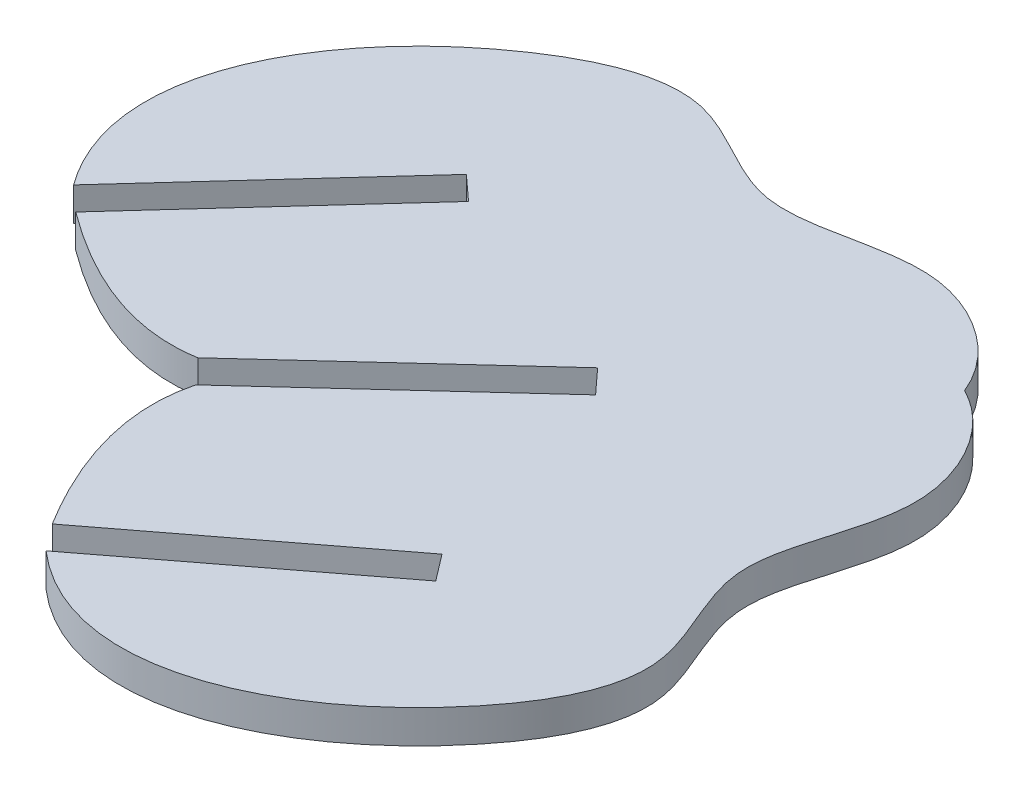
ISO-10303-21;
HEADER;
FILE_DESCRIPTION(('STEP AP214'),'2;1');
FILE_NAME('part.step','',(''),(''),'','','');
FILE_SCHEMA(('AUTOMOTIVE_DESIGN { 1 0 10303 214 1 1 1 1 }'));
ENDSEC;
DATA;
#1=APPLICATION_CONTEXT('core data for automotive mechanical design processes');
#2=APPLICATION_PROTOCOL_DEFINITION('international standard','automotive_design',2000,#1);
#3=PRODUCT_CONTEXT('',#1,'mechanical');
#4=PRODUCT('Part','Part','',(#3));
#5=PRODUCT_RELATED_PRODUCT_CATEGORY('part','',(#4));
#6=PRODUCT_DEFINITION_FORMATION('','',#4);
#7=PRODUCT_DEFINITION_CONTEXT('part definition',#1,'design');
#8=PRODUCT_DEFINITION('design','',#6,#7);
#9=PRODUCT_DEFINITION_SHAPE('','',#8);
#10=(LENGTH_UNIT() NAMED_UNIT(*) SI_UNIT(.MILLI.,.METRE.));
#11=(NAMED_UNIT(*) PLANE_ANGLE_UNIT() SI_UNIT($,.RADIAN.));
#12=(NAMED_UNIT(*) SI_UNIT($,.STERADIAN.) SOLID_ANGLE_UNIT());
#13=UNCERTAINTY_MEASURE_WITH_UNIT(LENGTH_MEASURE(1.E-05),#10,'distance_accuracy_value','');
#14=(GEOMETRIC_REPRESENTATION_CONTEXT(3) GLOBAL_UNCERTAINTY_ASSIGNED_CONTEXT((#13)) GLOBAL_UNIT_ASSIGNED_CONTEXT((#10,
#11,#12)) REPRESENTATION_CONTEXT('',''));
#15=CARTESIAN_POINT('',(0.,0.,0.));
#16=DIRECTION('',(0.,0.,1.));
#17=DIRECTION('',(1.,0.,0.));
#18=AXIS2_PLACEMENT_3D('',#15,#16,#17);
#19=CARTESIAN_POINT('',(81.0994367999328,4.,-150.56703628369));
#20=CARTESIAN_POINT('',(79.0122820906969,4.,-155.84502850874));
#21=CARTESIAN_POINT('',(66.9305380644599,4.,-164.303463431611));
#22=CARTESIAN_POINT('',(49.8308608522447,4.,-154.954744965791));
#23=CARTESIAN_POINT('',(35.0629310537073,4.,-167.647036362063));
#24=CARTESIAN_POINT('',(8.60085030682474,4.,-155.87260359418));
#25=CARTESIAN_POINT('',(-4.2661591605141,4.,-132.622255895945));
#26=CARTESIAN_POINT('',(6.05990815667762,4.,-118.392686306598));
#27=B_SPLINE_CURVE_WITH_KNOTS('',3,(#19,#20,#21,#22,#23,#24,#25,#26),.UNSPECIFIED.,.F.,.F.,(4,1,
1,1,1,4),(0.,0.14579698772316,0.314502546874439,0.439229594301928,0.588226764066923,1.),.UNSPECIFIED.);
#28=DIRECTION('',(0.,-1.,0.));
#29=VECTOR('',#28,1.);
#30=SURFACE_OF_LINEAR_EXTRUSION('',#27,#29);
#31=CARTESIAN_POINT('',(81.0994367999328,0.,-150.56703628369));
#32=CARTESIAN_POINT('',(79.0122820906969,0.,-155.84502850874));
#33=CARTESIAN_POINT('',(66.9305380644599,0.,-164.303463431611));
#34=CARTESIAN_POINT('',(49.8308608522447,0.,-154.954744965791));
#35=CARTESIAN_POINT('',(35.0629310537073,0.,-167.647036362063));
#36=CARTESIAN_POINT('',(8.60085030682474,0.,-155.87260359418));
#37=CARTESIAN_POINT('',(-4.2661591605141,0.,-132.622255895945));
#38=CARTESIAN_POINT('',(6.05990815667762,0.,-118.392686306598));
#39=B_SPLINE_CURVE_WITH_KNOTS('',3,(#31,#32,#33,#34,#35,#36,#37,#38),.UNSPECIFIED.,.F.,.F.,(4,1,
1,1,1,4),(0.,0.14579698772316,0.314502546874439,0.439229594301928,0.588226764066923,1.),.UNSPECIFIED.);
#40=CARTESIAN_POINT('',(81.0994367999328,0.,-150.56703628369));
#41=VERTEX_POINT('',#40);
#42=CARTESIAN_POINT('',(6.05990815667762,0.,-118.392686306598));
#43=VERTEX_POINT('',#42);
#44=EDGE_CURVE('E174',#41,#43,#39,.T.);
#45=ORIENTED_EDGE('',*,*,#44,.T.);
#46=DIRECTION('',(0.,-1.,0.));
#47=VECTOR('',#46,1.);
#48=CARTESIAN_POINT('',(6.05990815667762,4.,-118.392686306598));
#49=LINE('',#48,#47);
#50=CARTESIAN_POINT('',(6.05990815667762,4.,-118.392686306598));
#51=VERTEX_POINT('',#50);
#52=EDGE_CURVE('E11',#51,#43,#49,.T.);
#53=ORIENTED_EDGE('',*,*,#52,.F.);
#54=CARTESIAN_POINT('',(81.0994367999328,4.,-150.56703628369));
#55=VERTEX_POINT('',#54);
#56=EDGE_CURVE('E232',#55,#51,#27,.T.);
#57=ORIENTED_EDGE('',*,*,#56,.F.);
#58=DIRECTION('',(0.,-1.,0.));
#59=VECTOR('',#58,1.);
#60=CARTESIAN_POINT('',(81.0994367999328,4.,-150.56703628369));
#61=LINE('',#60,#59);
#62=EDGE_CURVE('E167',#55,#41,#61,.T.);
#63=ORIENTED_EDGE('',*,*,#62,.T.);
#64=EDGE_LOOP('',(#45,#53,#57,#63));
#65=FACE_BOUND('',#64,.T.);
#66=ADVANCED_FACE('F39',(#65),#30,.F.);
#67=CARTESIAN_POINT('',(6.05990815667762,4.,-118.392686306598));
#68=DIRECTION('',(-0.739205881695973,0.,-0.673479520450384));
#69=DIRECTION('',(-0.673479520450384,0.,0.739205881695973));
#70=AXIS2_PLACEMENT_3D('',#67,#68,#69);
#71=PLANE('',#70);
#72=DIRECTION('',(0.673479520450384,0.,-0.739205881695973));
#73=VECTOR('',#72,1.);
#74=CARTESIAN_POINT('',(6.05990815667762,0.,-118.392686306598));
#75=LINE('',#74,#73);
#76=CARTESIAN_POINT('',(28.5939733818908,0.,-143.125900973406));
#77=VERTEX_POINT('',#76);
#78=EDGE_CURVE('E264',#43,#77,#75,.T.);
#79=ORIENTED_EDGE('',*,*,#78,.T.);
#80=DIRECTION('',(0.,-1.,0.));
#81=VECTOR('',#80,1.);
#82=CARTESIAN_POINT('',(28.5939733818908,4.,-143.125900973406));
#83=LINE('',#82,#81);
#84=CARTESIAN_POINT('',(28.5939733818908,4.,-143.125900973406));
#85=VERTEX_POINT('',#84);
#86=EDGE_CURVE('E49',#85,#77,#83,.T.);
#87=ORIENTED_EDGE('',*,*,#86,.F.);
#88=DIRECTION('',(0.673479520450384,0.,-0.739205881695973));
#89=VECTOR('',#88,1.);
#90=CARTESIAN_POINT('',(6.05990815667762,4.,-118.392686306598));
#91=LINE('',#90,#89);
#92=EDGE_CURVE('E115',#51,#85,#91,.T.);
#93=ORIENTED_EDGE('',*,*,#92,.F.);
#94=ORIENTED_EDGE('',*,*,#52,.T.);
#95=EDGE_LOOP('',(#79,#87,#93,#94));
#96=FACE_BOUND('',#95,.T.);
#97=ADVANCED_FACE('F276',(#96),#71,.F.);
#98=CARTESIAN_POINT('',(28.5939733818908,4.,-143.125900973406));
#99=DIRECTION('',(0.673479520450383,0.,-0.739205881695974));
#100=DIRECTION('',(-0.739205881695974,0.,-0.673479520450383));
#101=AXIS2_PLACEMENT_3D('',#98,#99,#100);
#102=PLANE('',#101);
#103=DIRECTION('',(0.739205881695974,0.,0.673479520450383));
#104=VECTOR('',#103,1.);
#105=CARTESIAN_POINT('',(28.5939733818908,0.,-143.125900973406));
#106=LINE('',#105,#104);
#107=CARTESIAN_POINT('',(31.5507969086747,0.,-140.431982891604));
#108=VERTEX_POINT('',#107);
#109=EDGE_CURVE('E261',#77,#108,#106,.T.);
#110=ORIENTED_EDGE('',*,*,#109,.T.);
#111=DIRECTION('',(0.,-1.,0.));
#112=VECTOR('',#111,1.);
#113=CARTESIAN_POINT('',(31.5507969086747,4.,-140.431982891604));
#114=LINE('',#113,#112);
#115=CARTESIAN_POINT('',(31.5507969086747,4.,-140.431982891604));
#116=VERTEX_POINT('',#115);
#117=EDGE_CURVE('E355',#116,#108,#114,.T.);
#118=ORIENTED_EDGE('',*,*,#117,.F.);
#119=DIRECTION('',(0.739205881695974,0.,0.673479520450383));
#120=VECTOR('',#119,1.);
#121=CARTESIAN_POINT('',(28.5939733818908,4.,-143.125900973406));
#122=LINE('',#121,#120);
#123=EDGE_CURVE('E227',#85,#116,#122,.T.);
#124=ORIENTED_EDGE('',*,*,#123,.F.);
#125=ORIENTED_EDGE('',*,*,#86,.T.);
#126=EDGE_LOOP('',(#110,#118,#124,#125));
#127=FACE_BOUND('',#126,.T.);
#128=ADVANCED_FACE('F278',(#127),#102,.F.);
#129=CARTESIAN_POINT('',(31.5507969086747,4.,-140.431982891604));
#130=DIRECTION('',(0.739205881695973,0.,0.673479520450384));
#131=DIRECTION('',(0.673479520450384,0.,-0.739205881695973));
#132=AXIS2_PLACEMENT_3D('',#129,#130,#131);
#133=PLANE('',#132);
#134=DIRECTION('',(-0.673479520450384,0.,0.739205881695973));
#135=VECTOR('',#134,1.);
#136=CARTESIAN_POINT('',(31.5507969086747,0.,-140.431982891604));
#137=LINE('',#136,#135);
#138=CARTESIAN_POINT('',(9.01673168346152,0.,-115.698768224796));
#139=VERTEX_POINT('',#138);
#140=EDGE_CURVE('E258',#108,#139,#137,.T.);
#141=ORIENTED_EDGE('',*,*,#140,.T.);
#142=DIRECTION('',(0.,-1.,0.));
#143=VECTOR('',#142,1.);
#144=CARTESIAN_POINT('',(9.01673168346152,4.,-115.698768224796));
#145=LINE('',#144,#143);
#146=CARTESIAN_POINT('',(9.01673168346152,4.,-115.698768224796));
#147=VERTEX_POINT('',#146);
#148=EDGE_CURVE('E351',#147,#139,#145,.T.);
#149=ORIENTED_EDGE('',*,*,#148,.F.);
#150=DIRECTION('',(-0.673479520450384,0.,0.739205881695973));
#151=VECTOR('',#150,1.);
#152=CARTESIAN_POINT('',(31.5507969086747,4.,-140.431982891604));
#153=LINE('',#152,#151);
#154=EDGE_CURVE('E224',#116,#147,#153,.T.);
#155=ORIENTED_EDGE('',*,*,#154,.F.);
#156=ORIENTED_EDGE('',*,*,#117,.T.);
#157=EDGE_LOOP('',(#141,#149,#155,#156));
#158=FACE_BOUND('',#157,.T.);
#159=ADVANCED_FACE('F283',(#158),#133,.F.);
#160=CARTESIAN_POINT('',(9.01673168346152,4.,-115.698768224796));
#161=CARTESIAN_POINT('',(21.8316742048472,4.,-106.194204472013));
#162=CARTESIAN_POINT('',(31.5507969086747,4.,-107.859296928497));
#163=B_SPLINE_CURVE_WITH_KNOTS('',2,(#160,#161,#162),.UNSPECIFIED.,.F.,.F.,(3,3),(0.,1.),.UNSPECIFIED.);
#164=DIRECTION('',(0.,-1.,0.));
#165=VECTOR('',#164,1.);
#166=SURFACE_OF_LINEAR_EXTRUSION('',#163,#165);
#167=CARTESIAN_POINT('',(9.01673168346152,0.,-115.698768224796));
#168=CARTESIAN_POINT('',(21.8316742048472,0.,-106.194204472013));
#169=CARTESIAN_POINT('',(31.5507969086747,0.,-107.859296928497));
#170=B_SPLINE_CURVE_WITH_KNOTS('',2,(#167,#168,#169),.UNSPECIFIED.,.F.,.F.,(3,3),(0.,1.),.UNSPECIFIED.);
#171=CARTESIAN_POINT('',(31.5507969086747,0.,-107.859296928497));
#172=VERTEX_POINT('',#171);
#173=EDGE_CURVE('E255',#139,#172,#170,.T.);
#174=ORIENTED_EDGE('',*,*,#173,.T.);
#175=DIRECTION('',(0.,-1.,0.));
#176=VECTOR('',#175,1.);
#177=CARTESIAN_POINT('',(31.5507969086747,4.,-107.859296928497));
#178=LINE('',#177,#176);
#179=CARTESIAN_POINT('',(31.5507969086747,4.,-107.859296928497));
#180=VERTEX_POINT('',#179);
#181=EDGE_CURVE('E347',#180,#172,#178,.T.);
#182=ORIENTED_EDGE('',*,*,#181,.F.);
#183=EDGE_CURVE('E221',#147,#180,#163,.T.);
#184=ORIENTED_EDGE('',*,*,#183,.F.);
#185=ORIENTED_EDGE('',*,*,#148,.T.);
#186=EDGE_LOOP('',(#174,#182,#184,#185));
#187=FACE_BOUND('',#186,.T.);
#188=ADVANCED_FACE('F289',(#187),#166,.F.);
#189=CARTESIAN_POINT('',(31.5507969086747,4.,-107.859296928497));
#190=DIRECTION('',(-0.675735345788661,0.,-0.737144315891996));
#191=DIRECTION('',(-0.737144315891996,0.,0.675735345788661));
#192=AXIS2_PLACEMENT_3D('',#189,#190,#191);
#193=PLANE('',#192);
#194=DIRECTION('',(0.737144315891996,0.,-0.675735345788661));
#195=VECTOR('',#194,1.);
#196=CARTESIAN_POINT('',(31.5507969086747,0.,-107.859296928497));
#197=LINE('',#196,#195);
#198=CARTESIAN_POINT('',(56.6490355149376,0.,-130.866687174418));
#199=VERTEX_POINT('',#198);
#200=EDGE_CURVE('E252',#172,#199,#197,.T.);
#201=ORIENTED_EDGE('',*,*,#200,.T.);
#202=DIRECTION('',(0.,-1.,0.));
#203=VECTOR('',#202,1.);
#204=CARTESIAN_POINT('',(56.6490355149376,4.,-130.866687174418));
#205=LINE('',#204,#203);
#206=CARTESIAN_POINT('',(56.6490355149376,4.,-130.866687174418));
#207=VERTEX_POINT('',#206);
#208=EDGE_CURVE('E324',#207,#199,#205,.T.);
#209=ORIENTED_EDGE('',*,*,#208,.F.);
#210=DIRECTION('',(0.737144315891996,0.,-0.675735345788661));
#211=VECTOR('',#210,1.);
#212=CARTESIAN_POINT('',(31.5507969086747,4.,-107.859296928497));
#213=LINE('',#212,#211);
#214=EDGE_CURVE('E219',#180,#207,#213,.T.);
#215=ORIENTED_EDGE('',*,*,#214,.F.);
#216=ORIENTED_EDGE('',*,*,#181,.T.);
#217=EDGE_LOOP('',(#201,#209,#215,#216));
#218=FACE_BOUND('',#217,.T.);
#219=ADVANCED_FACE('F293',(#218),#193,.F.);
#220=CARTESIAN_POINT('',(56.6490355149376,4.,-130.866687174418));
#221=DIRECTION('',(0.737144315891995,0.,-0.675735345788662));
#222=DIRECTION('',(-0.675735345788662,0.,-0.737144315891995));
#223=AXIS2_PLACEMENT_3D('',#220,#221,#222);
#224=PLANE('',#223);
#225=DIRECTION('',(0.675735345788662,0.,0.737144315891995));
#226=VECTOR('',#225,1.);
#227=CARTESIAN_POINT('',(56.6490355149376,0.,-130.866687174418));
#228=LINE('',#227,#226);
#229=CARTESIAN_POINT('',(59.3519768980923,0.,-127.91810991085));
#230=VERTEX_POINT('',#229);
#231=EDGE_CURVE('E249',#199,#230,#228,.T.);
#232=ORIENTED_EDGE('',*,*,#231,.T.);
#233=DIRECTION('',(0.,-1.,0.));
#234=VECTOR('',#233,1.);
#235=CARTESIAN_POINT('',(59.3519768980923,4.,-127.91810991085));
#236=LINE('',#235,#234);
#237=CARTESIAN_POINT('',(59.3519768980923,4.,-127.91810991085));
#238=VERTEX_POINT('',#237);
#239=EDGE_CURVE('E321',#238,#230,#236,.T.);
#240=ORIENTED_EDGE('',*,*,#239,.F.);
#241=DIRECTION('',(0.675735345788662,0.,0.737144315891995));
#242=VECTOR('',#241,1.);
#243=CARTESIAN_POINT('',(56.6490355149376,4.,-130.866687174418));
#244=LINE('',#243,#242);
#245=EDGE_CURVE('E217',#207,#238,#244,.T.);
#246=ORIENTED_EDGE('',*,*,#245,.F.);
#247=ORIENTED_EDGE('',*,*,#208,.T.);
#248=EDGE_LOOP('',(#232,#240,#246,#247));
#249=FACE_BOUND('',#248,.T.);
#250=ADVANCED_FACE('F308',(#249),#224,.F.);
#251=CARTESIAN_POINT('',(34.2537382918293,4.,-104.910719664929));
#252=DIRECTION('',(0.675735345788661,0.,0.737144315891996));
#253=DIRECTION('',(0.737144315891996,0.,-0.675735345788661));
#254=AXIS2_PLACEMENT_3D('',#251,#252,#253);
#255=PLANE('',#254);
#256=DIRECTION('',(-0.737144315891996,0.,0.675735345788661));
#257=VECTOR('',#256,1.);
#258=CARTESIAN_POINT('',(34.2537382918293,0.,-104.910719664929));
#259=LINE('',#258,#257);
#260=CARTESIAN_POINT('',(34.2537382918293,0.,-104.910719664929));
#261=VERTEX_POINT('',#260);
#262=EDGE_CURVE('E246',#230,#261,#259,.T.);
#263=ORIENTED_EDGE('',*,*,#262,.T.);
#264=DIRECTION('',(0.,-1.,0.));
#265=VECTOR('',#264,1.);
#266=CARTESIAN_POINT('',(34.2537382918293,4.,-104.910719664929));
#267=LINE('',#266,#265);
#268=CARTESIAN_POINT('',(34.2537382918293,4.,-104.910719664929));
#269=VERTEX_POINT('',#268);
#270=EDGE_CURVE('E330',#269,#261,#267,.T.);
#271=ORIENTED_EDGE('',*,*,#270,.F.);
#272=DIRECTION('',(-0.737144315891996,0.,0.675735345788661));
#273=VECTOR('',#272,1.);
#274=CARTESIAN_POINT('',(34.2537382918293,4.,-104.910719664929));
#275=LINE('',#274,#273);
#276=EDGE_CURVE('E209',#238,#269,#275,.T.);
#277=ORIENTED_EDGE('',*,*,#276,.F.);
#278=ORIENTED_EDGE('',*,*,#239,.T.);
#279=EDGE_LOOP('',(#263,#271,#277,#278));
#280=FACE_BOUND('',#279,.T.);
#281=ADVANCED_FACE('F200',(#280),#255,.F.);
#282=CARTESIAN_POINT('',(34.2537382918293,4.,-104.910719664929));
#283=CARTESIAN_POINT('',(31.7516600455927,4.,-95.3727175958161));
#284=CARTESIAN_POINT('',(40.1085124308988,4.,-81.7814519385149));
#285=B_SPLINE_CURVE_WITH_KNOTS('',2,(#282,#283,#284),.UNSPECIFIED.,.F.,.F.,(3,3),(0.,1.),.UNSPECIFIED.);
#286=DIRECTION('',(0.,-1.,0.));
#287=VECTOR('',#286,1.);
#288=SURFACE_OF_LINEAR_EXTRUSION('',#285,#287);
#289=CARTESIAN_POINT('',(34.2537382918293,0.,-104.910719664929));
#290=CARTESIAN_POINT('',(31.7516600455927,0.,-95.3727175958161));
#291=CARTESIAN_POINT('',(40.1085124308988,0.,-81.7814519385149));
#292=B_SPLINE_CURVE_WITH_KNOTS('',2,(#289,#290,#291),.UNSPECIFIED.,.F.,.F.,(3,3),(0.,1.),.UNSPECIFIED.);
#293=CARTESIAN_POINT('',(40.1085124308988,0.,-81.7814519385149));
#294=VERTEX_POINT('',#293);
#295=EDGE_CURVE('E243',#261,#294,#292,.T.);
#296=ORIENTED_EDGE('',*,*,#295,.T.);
#297=DIRECTION('',(0.,-1.,0.));
#298=VECTOR('',#297,1.);
#299=CARTESIAN_POINT('',(40.1085124308988,4.,-81.7814519385149));
#300=LINE('',#299,#298);
#301=CARTESIAN_POINT('',(40.1085124308988,4.,-81.7814519385149));
#302=VERTEX_POINT('',#301);
#303=EDGE_CURVE('E337',#302,#294,#300,.T.);
#304=ORIENTED_EDGE('',*,*,#303,.F.);
#305=EDGE_CURVE('E203',#269,#302,#285,.T.);
#306=ORIENTED_EDGE('',*,*,#305,.F.);
#307=ORIENTED_EDGE('',*,*,#270,.T.);
#308=EDGE_LOOP('',(#296,#304,#306,#307));
#309=FACE_BOUND('',#308,.T.);
#310=ADVANCED_FACE('F195',(#309),#288,.F.);
#311=CARTESIAN_POINT('',(66.703590649394,4.,-102.084599918094));
#312=DIRECTION('',(-0.606803709328966,0.,-0.794851720979837));
#313=DIRECTION('',(-0.794851720979837,0.,0.606803709328966));
#314=AXIS2_PLACEMENT_3D('',#311,#312,#313);
#315=PLANE('',#314);
#316=DIRECTION('',(0.794851720979837,0.,-0.606803709328966));
#317=VECTOR('',#316,1.);
#318=CARTESIAN_POINT('',(66.703590649394,0.,-102.084599918094));
#319=LINE('',#318,#317);
#320=CARTESIAN_POINT('',(66.703590649394,0.,-102.084599918094));
#321=VERTEX_POINT('',#320);
#322=EDGE_CURVE('E240',#294,#321,#319,.T.);
#323=ORIENTED_EDGE('',*,*,#322,.T.);
#324=DIRECTION('',(0.,-1.,0.));
#325=VECTOR('',#324,1.);
#326=CARTESIAN_POINT('',(66.703590649394,4.,-102.084599918094));
#327=LINE('',#326,#325);
#328=CARTESIAN_POINT('',(66.703590649394,4.,-102.084599918094));
#329=VERTEX_POINT('',#328);
#330=EDGE_CURVE('E160',#329,#321,#327,.T.);
#331=ORIENTED_EDGE('',*,*,#330,.F.);
#332=DIRECTION('',(0.794851720979837,0.,-0.606803709328966));
#333=VECTOR('',#332,1.);
#334=CARTESIAN_POINT('',(66.703590649394,4.,-102.084599918094));
#335=LINE('',#334,#333);
#336=EDGE_CURVE('E149',#302,#329,#335,.T.);
#337=ORIENTED_EDGE('',*,*,#336,.F.);
#338=ORIENTED_EDGE('',*,*,#303,.T.);
#339=EDGE_LOOP('',(#323,#331,#337,#338));
#340=FACE_BOUND('',#339,.T.);
#341=ADVANCED_FACE('F192',(#340),#315,.F.);
#342=CARTESIAN_POINT('',(69.1308054867098,4.,-98.9051930341748));
#343=DIRECTION('',(0.794851720979837,0.,-0.606803709328965));
#344=DIRECTION('',(-0.606803709328965,0.,-0.794851720979837));
#345=AXIS2_PLACEMENT_3D('',#342,#343,#344);
#346=PLANE('',#345);
#347=DIRECTION('',(0.606803709328965,0.,0.794851720979837));
#348=VECTOR('',#347,1.);
#349=CARTESIAN_POINT('',(69.1308054867098,0.,-98.9051930341748));
#350=LINE('',#349,#348);
#351=CARTESIAN_POINT('',(69.1308054867098,0.,-98.9051930341748));
#352=VERTEX_POINT('',#351);
#353=EDGE_CURVE('E158',#321,#352,#350,.T.);
#354=ORIENTED_EDGE('',*,*,#353,.T.);
#355=DIRECTION('',(0.,-1.,0.));
#356=VECTOR('',#355,1.);
#357=CARTESIAN_POINT('',(69.1308054867098,4.,-98.9051930341748));
#358=LINE('',#357,#356);
#359=CARTESIAN_POINT('',(69.1308054867098,4.,-98.9051930341748));
#360=VERTEX_POINT('',#359);
#361=EDGE_CURVE('E155',#360,#352,#358,.T.);
#362=ORIENTED_EDGE('',*,*,#361,.F.);
#363=DIRECTION('',(0.606803709328965,0.,0.794851720979837));
#364=VECTOR('',#363,1.);
#365=CARTESIAN_POINT('',(69.1308054867098,4.,-98.9051930341748));
#366=LINE('',#365,#364);
#367=EDGE_CURVE('E143',#329,#360,#366,.T.);
#368=ORIENTED_EDGE('',*,*,#367,.F.);
#369=ORIENTED_EDGE('',*,*,#330,.T.);
#370=EDGE_LOOP('',(#354,#362,#368,#369));
#371=FACE_BOUND('',#370,.T.);
#372=ADVANCED_FACE('F156',(#371),#346,.F.);
#373=CARTESIAN_POINT('',(42.5357272682147,4.,-78.6020450545956));
#374=DIRECTION('',(0.606803709328966,0.,0.794851720979837));
#375=DIRECTION('',(0.794851720979837,0.,-0.606803709328966));
#376=AXIS2_PLACEMENT_3D('',#373,#374,#375);
#377=PLANE('',#376);
#378=DIRECTION('',(-0.794851720979836,0.,0.606803709328966));
#379=VECTOR('',#378,1.);
#380=CARTESIAN_POINT('',(42.5357272682147,0.,-78.6020450545956));
#381=LINE('',#380,#379);
#382=CARTESIAN_POINT('',(42.5357272682147,0.,-78.6020450545956));
#383=VERTEX_POINT('',#382);
#384=EDGE_CURVE('E101',#352,#383,#381,.T.);
#385=ORIENTED_EDGE('',*,*,#384,.T.);
#386=DIRECTION('',(0.,-1.,0.));
#387=VECTOR('',#386,1.);
#388=CARTESIAN_POINT('',(42.5357272682147,4.,-78.6020450545956));
#389=LINE('',#388,#387);
#390=CARTESIAN_POINT('',(42.5357272682147,4.,-78.6020450545956));
#391=VERTEX_POINT('',#390);
#392=EDGE_CURVE('E161',#391,#383,#389,.T.);
#393=ORIENTED_EDGE('',*,*,#392,.F.);
#394=DIRECTION('',(-0.794851720979836,0.,0.606803709328966));
#395=VECTOR('',#394,1.);
#396=CARTESIAN_POINT('',(42.5357272682147,4.,-78.6020450545956));
#397=LINE('',#396,#395);
#398=EDGE_CURVE('E147',#360,#391,#397,.T.);
#399=ORIENTED_EDGE('',*,*,#398,.F.);
#400=ORIENTED_EDGE('',*,*,#361,.T.);
#401=EDGE_LOOP('',(#385,#393,#399,#400));
#402=FACE_BOUND('',#401,.T.);
#403=ADVANCED_FACE('F163',(#402),#377,.F.);
#404=CARTESIAN_POINT('',(42.5357272682147,4.,-78.6020450545956));
#405=CARTESIAN_POINT('',(55.8157106881785,4.,-67.0803109271849));
#406=CARTESIAN_POINT('',(80.0947664744852,4.,-77.8815169175739));
#407=CARTESIAN_POINT('',(94.1207394743923,4.,-103.222216707947));
#408=CARTESIAN_POINT('',(82.7576285450719,4.,-119.035683166329));
#409=CARTESIAN_POINT('',(93.5547200032519,4.,-135.259749048802));
#410=CARTESIAN_POINT('',(86.176436575023,4.,-148.02981536471));
#411=CARTESIAN_POINT('',(81.0994367999328,4.,-150.56703628369));
#412=B_SPLINE_CURVE_WITH_KNOTS('',3,(#404,#405,#406,#407,#408,#409,#410,#411),.UNSPECIFIED.,.F.,
.F.,(4,1,1,1,1,4),(0.,0.411773235933078,0.560770405698072,0.685497453125561,0.85420301227684,
1.),.UNSPECIFIED.);
#413=DIRECTION('',(0.,-1.,0.));
#414=VECTOR('',#413,1.);
#415=SURFACE_OF_LINEAR_EXTRUSION('',#412,#414);
#416=CARTESIAN_POINT('',(42.5357272682147,0.,-78.6020450545956));
#417=CARTESIAN_POINT('',(55.8157106881785,0.,-67.0803109271849));
#418=CARTESIAN_POINT('',(80.0947664744852,0.,-77.8815169175739));
#419=CARTESIAN_POINT('',(94.1207394743923,0.,-103.222216707947));
#420=CARTESIAN_POINT('',(82.7576285450719,0.,-119.035683166329));
#421=CARTESIAN_POINT('',(93.5547200032519,0.,-135.259749048802));
#422=CARTESIAN_POINT('',(86.176436575023,0.,-148.02981536471));
#423=CARTESIAN_POINT('',(81.0994367999328,0.,-150.56703628369));
#424=B_SPLINE_CURVE_WITH_KNOTS('',3,(#416,#417,#418,#419,#420,#421,#422,#423),.UNSPECIFIED.,.F.,
.F.,(4,1,1,1,1,4),(0.,0.411773235933078,0.560770405698072,0.685497453125561,0.85420301227684,
1.),.UNSPECIFIED.);
#425=EDGE_CURVE('E107',#383,#41,#424,.T.);
#426=ORIENTED_EDGE('',*,*,#425,.T.);
#427=ORIENTED_EDGE('',*,*,#62,.F.);
#428=EDGE_CURVE('E57',#391,#55,#412,.T.);
#429=ORIENTED_EDGE('',*,*,#428,.F.);
#430=ORIENTED_EDGE('',*,*,#392,.T.);
#431=EDGE_LOOP('',(#426,#427,#429,#430));
#432=FACE_BOUND('',#431,.T.);
#433=ADVANCED_FACE('F182',(#432),#415,.F.);
#434=CARTESIAN_POINT('',(28.9162096044965,4.,-164.094920953579));
#435=DIRECTION('',(0.,1.,0.));
#436=DIRECTION('',(0.,0.,1.));
#437=AXIS2_PLACEMENT_3D('',#434,#435,#436);
#438=PLANE('',#437);
#439=ORIENTED_EDGE('',*,*,#56,.T.);
#440=ORIENTED_EDGE('',*,*,#92,.T.);
#441=ORIENTED_EDGE('',*,*,#123,.T.);
#442=ORIENTED_EDGE('',*,*,#154,.T.);
#443=ORIENTED_EDGE('',*,*,#183,.T.);
#444=ORIENTED_EDGE('',*,*,#214,.T.);
#445=ORIENTED_EDGE('',*,*,#245,.T.);
#446=ORIENTED_EDGE('',*,*,#276,.T.);
#447=ORIENTED_EDGE('',*,*,#305,.T.);
#448=ORIENTED_EDGE('',*,*,#336,.T.);
#449=ORIENTED_EDGE('',*,*,#367,.T.);
#450=ORIENTED_EDGE('',*,*,#398,.T.);
#451=ORIENTED_EDGE('',*,*,#428,.T.);
#452=EDGE_LOOP('',(#439,#440,#441,#442,#443,#444,#445,#446,#447,#448,#449,#450,#451));
#453=FACE_BOUND('',#452,.T.);
#454=ADVANCED_FACE('F145',(#453),#438,.T.);
#455=CARTESIAN_POINT('',(28.9162096044965,0.,-164.094920953579));
#456=DIRECTION('',(0.,1.,0.));
#457=DIRECTION('',(0.,0.,1.));
#458=AXIS2_PLACEMENT_3D('',#455,#456,#457);
#459=PLANE('',#458);
#460=ORIENTED_EDGE('',*,*,#44,.F.);
#461=ORIENTED_EDGE('',*,*,#425,.F.);
#462=ORIENTED_EDGE('',*,*,#384,.F.);
#463=ORIENTED_EDGE('',*,*,#353,.F.);
#464=ORIENTED_EDGE('',*,*,#322,.F.);
#465=ORIENTED_EDGE('',*,*,#295,.F.);
#466=ORIENTED_EDGE('',*,*,#262,.F.);
#467=ORIENTED_EDGE('',*,*,#231,.F.);
#468=ORIENTED_EDGE('',*,*,#200,.F.);
#469=ORIENTED_EDGE('',*,*,#173,.F.);
#470=ORIENTED_EDGE('',*,*,#140,.F.);
#471=ORIENTED_EDGE('',*,*,#109,.F.);
#472=ORIENTED_EDGE('',*,*,#78,.F.);
#473=EDGE_LOOP('',(#460,#461,#462,#463,#464,#465,#466,#467,#468,#469,#470,#471,#472));
#474=FACE_BOUND('',#473,.T.);
#475=ADVANCED_FACE('F186',(#474),#459,.F.);
#476=CLOSED_SHELL('',(#66,#97,#128,#159,#188,#219,#250,#281,#310,#341,#372,#403,#433,#454,#475));
#477=MANIFOLD_SOLID_BREP('B2',#476);
#478=ADVANCED_BREP_SHAPE_REPRESENTATION('',(#18,#477),#14);
#479=SHAPE_DEFINITION_REPRESENTATION(#9,#478);
ENDSEC;
END-ISO-10303-21;
